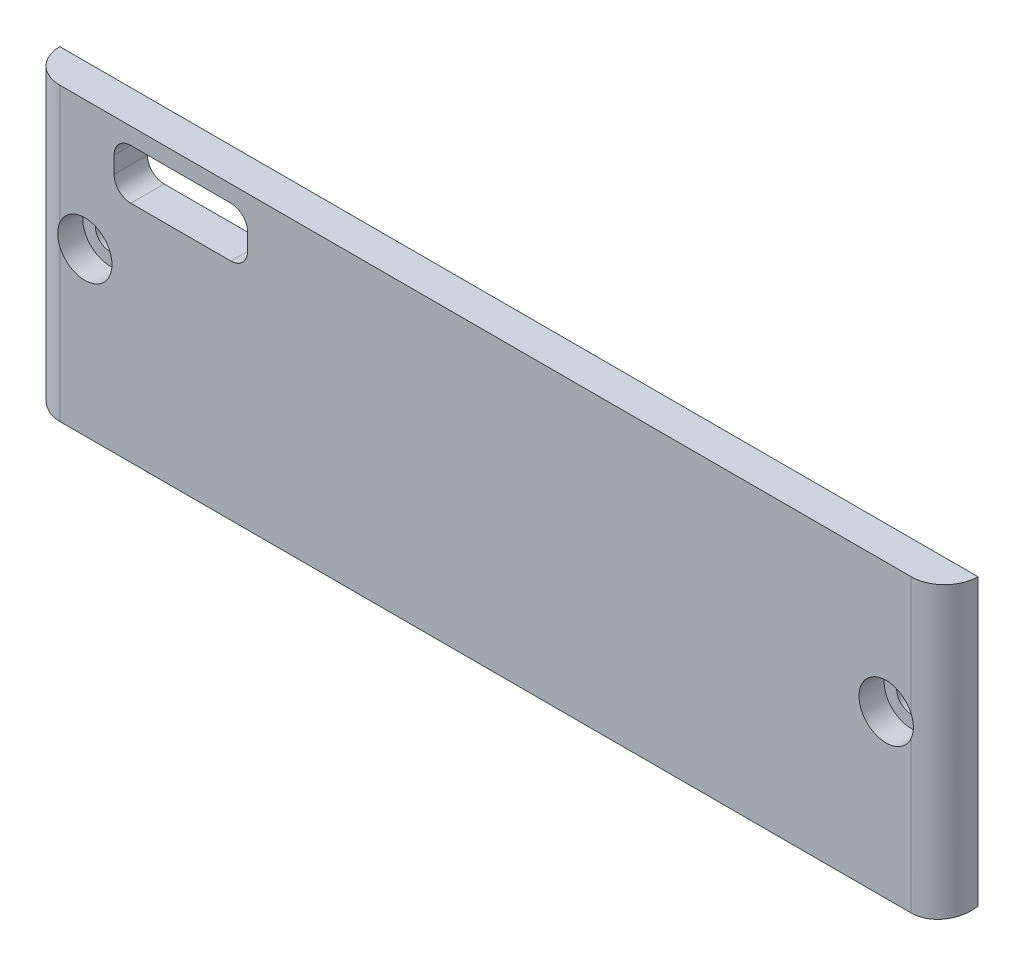
ISO-10303-21;
HEADER;
FILE_DESCRIPTION(('STEP AP214'),'2;1');
FILE_NAME('part.step','',(''),(''),'','','');
FILE_SCHEMA(('AUTOMOTIVE_DESIGN { 1 0 10303 214 1 1 1 1 }'));
ENDSEC;
DATA;
#1=APPLICATION_CONTEXT('core data for automotive mechanical design processes');
#2=APPLICATION_PROTOCOL_DEFINITION('international standard','automotive_design',2000,#1);
#3=PRODUCT_CONTEXT('',#1,'mechanical');
#4=PRODUCT('Part','Part','',(#3));
#5=PRODUCT_RELATED_PRODUCT_CATEGORY('part','',(#4));
#6=PRODUCT_DEFINITION_FORMATION('','',#4);
#7=PRODUCT_DEFINITION_CONTEXT('part definition',#1,'design');
#8=PRODUCT_DEFINITION('design','',#6,#7);
#9=PRODUCT_DEFINITION_SHAPE('','',#8);
#10=(LENGTH_UNIT() NAMED_UNIT(*) SI_UNIT(.MILLI.,.METRE.));
#11=(NAMED_UNIT(*) PLANE_ANGLE_UNIT() SI_UNIT($,.RADIAN.));
#12=(NAMED_UNIT(*) SI_UNIT($,.STERADIAN.) SOLID_ANGLE_UNIT());
#13=UNCERTAINTY_MEASURE_WITH_UNIT(LENGTH_MEASURE(1.E-05),#10,'distance_accuracy_value','');
#14=(GEOMETRIC_REPRESENTATION_CONTEXT(3) GLOBAL_UNCERTAINTY_ASSIGNED_CONTEXT((#13)) GLOBAL_UNIT_ASSIGNED_CONTEXT((#10,
#11,#12)) REPRESENTATION_CONTEXT('',''));
#15=CARTESIAN_POINT('',(0.,0.,0.));
#16=DIRECTION('',(0.,0.,1.));
#17=DIRECTION('',(1.,0.,0.));
#18=AXIS2_PLACEMENT_3D('',#15,#16,#17);
#19=CARTESIAN_POINT('',(103.,18.69,0.));
#20=DIRECTION('',(0.,0.,1.));
#21=DIRECTION('',(1.,0.,0.));
#22=AXIS2_PLACEMENT_3D('',#19,#20,#21);
#23=CYLINDRICAL_SURFACE('',#22,1.75);
#24=CARTESIAN_POINT('',(103.,18.69,0.));
#25=DIRECTION('',(0.,0.,1.));
#26=DIRECTION('',(1.,0.,0.));
#27=AXIS2_PLACEMENT_3D('',#24,#25,#26);
#28=CIRCLE('',#27,1.75);
#29=CARTESIAN_POINT('',(104.75,18.69,0.));
#30=VERTEX_POINT('',#29);
#31=EDGE_CURVE('E272',#30,#30,#28,.T.);
#32=ORIENTED_EDGE('',*,*,#31,.F.);
#33=EDGE_LOOP('',(#32));
#34=FACE_BOUND('',#33,.T.);
#35=CARTESIAN_POINT('',(103.,18.69,1.));
#36=DIRECTION('',(0.,0.,1.));
#37=DIRECTION('',(1.,0.,0.));
#38=AXIS2_PLACEMENT_3D('',#35,#36,#37);
#39=CIRCLE('',#38,1.75);
#40=CARTESIAN_POINT('',(104.75,18.69,1.));
#41=VERTEX_POINT('',#40);
#42=EDGE_CURVE('E275',#41,#41,#39,.F.);
#43=ORIENTED_EDGE('',*,*,#42,.F.);
#44=EDGE_LOOP('',(#43));
#45=FACE_BOUND('',#44,.T.);
#46=ADVANCED_FACE('F43',(#34,#45),#23,.F.);
#47=CARTESIAN_POINT('',(7.,18.69,0.));
#48=DIRECTION('',(0.,0.,1.));
#49=DIRECTION('',(1.,0.,0.));
#50=AXIS2_PLACEMENT_3D('',#47,#48,#49);
#51=CYLINDRICAL_SURFACE('',#50,1.75);
#52=CARTESIAN_POINT('',(7.,18.69,0.));
#53=DIRECTION('',(0.,0.,1.));
#54=DIRECTION('',(1.,0.,0.));
#55=AXIS2_PLACEMENT_3D('',#52,#53,#54);
#56=CIRCLE('',#55,1.75);
#57=CARTESIAN_POINT('',(8.75,18.69,0.));
#58=VERTEX_POINT('',#57);
#59=EDGE_CURVE('E267',#58,#58,#56,.T.);
#60=ORIENTED_EDGE('',*,*,#59,.F.);
#61=EDGE_LOOP('',(#60));
#62=FACE_BOUND('',#61,.T.);
#63=CARTESIAN_POINT('',(7.,18.69,1.));
#64=DIRECTION('',(0.,0.,1.));
#65=DIRECTION('',(1.,0.,0.));
#66=AXIS2_PLACEMENT_3D('',#63,#64,#65);
#67=CIRCLE('',#66,1.75);
#68=CARTESIAN_POINT('',(8.75,18.69,1.));
#69=VERTEX_POINT('',#68);
#70=EDGE_CURVE('E255',#69,#69,#67,.F.);
#71=ORIENTED_EDGE('',*,*,#70,.F.);
#72=EDGE_LOOP('',(#71));
#73=FACE_BOUND('',#72,.T.);
#74=ADVANCED_FACE('F345',(#62,#73),#51,.F.);
#75=CARTESIAN_POINT('',(0.,34.19,4.));
#76=DIRECTION('',(0.,-1.,0.));
#77=DIRECTION('',(0.,0.,-1.));
#78=AXIS2_PLACEMENT_3D('',#75,#76,#77);
#79=PLANE('',#78);
#80=DIRECTION('',(-1.,0.,0.));
#81=VECTOR('',#80,1.);
#82=CARTESIAN_POINT('',(0.,34.19,0.));
#83=LINE('',#82,#81);
#84=CARTESIAN_POINT('',(110.,34.19,0.));
#85=VERTEX_POINT('',#84);
#86=CARTESIAN_POINT('',(0.,34.19,0.));
#87=VERTEX_POINT('',#86);
#88=EDGE_CURVE('E283',#85,#87,#83,.T.);
#89=ORIENTED_EDGE('',*,*,#88,.T.);
#90=CARTESIAN_POINT('',(4.,34.19,0.));
#91=DIRECTION('',(0.,-1.,0.));
#92=DIRECTION('',(0.,0.,-1.));
#93=AXIS2_PLACEMENT_3D('',#90,#91,#92);
#94=CIRCLE('',#93,4.);
#95=CARTESIAN_POINT('',(4.,34.19,4.));
#96=VERTEX_POINT('',#95);
#97=EDGE_CURVE('E58',#87,#96,#94,.F.);
#98=ORIENTED_EDGE('',*,*,#97,.T.);
#99=DIRECTION('',(-1.,0.,0.));
#100=VECTOR('',#99,1.);
#101=CARTESIAN_POINT('',(0.,34.19,4.));
#102=LINE('',#101,#100);
#103=CARTESIAN_POINT('',(106.,34.19,4.));
#104=VERTEX_POINT('',#103);
#105=EDGE_CURVE('E280',#104,#96,#102,.T.);
#106=ORIENTED_EDGE('',*,*,#105,.F.);
#107=CARTESIAN_POINT('',(106.,34.19,0.));
#108=DIRECTION('',(0.,-1.,0.));
#109=DIRECTION('',(0.,0.,-1.));
#110=AXIS2_PLACEMENT_3D('',#107,#108,#109);
#111=CIRCLE('',#110,4.);
#112=EDGE_CURVE('E367',#104,#85,#111,.F.);
#113=ORIENTED_EDGE('',*,*,#112,.T.);
#114=EDGE_LOOP('',(#89,#98,#106,#113));
#115=FACE_BOUND('',#114,.T.);
#116=ADVANCED_FACE('F348',(#115),#79,.F.);
#117=CARTESIAN_POINT('',(0.,0.,4.));
#118=DIRECTION('',(0.,0.,-1.));
#119=DIRECTION('',(-1.,0.,0.));
#120=AXIS2_PLACEMENT_3D('',#117,#118,#119);
#121=PLANE('',#120);
#122=DIRECTION('',(0.,-1.,0.));
#123=VECTOR('',#122,1.);
#124=CARTESIAN_POINT('',(10.5,30.19,4.));
#125=LINE('',#124,#123);
#126=CARTESIAN_POINT('',(10.5,30.19,4.));
#127=VERTEX_POINT('',#126);
#128=CARTESIAN_POINT('',(10.5,28.19,4.));
#129=VERTEX_POINT('',#128);
#130=EDGE_CURVE('E208',#127,#129,#125,.T.);
#131=ORIENTED_EDGE('',*,*,#130,.F.);
#132=CARTESIAN_POINT('',(12.5,30.19,4.));
#133=DIRECTION('',(0.,0.,1.));
#134=DIRECTION('',(-1.,0.,0.));
#135=AXIS2_PLACEMENT_3D('',#132,#133,#134);
#136=CIRCLE('',#135,2.);
#137=CARTESIAN_POINT('',(12.5,32.19,4.));
#138=VERTEX_POINT('',#137);
#139=EDGE_CURVE('E157',#138,#127,#136,.T.);
#140=ORIENTED_EDGE('',*,*,#139,.F.);
#141=DIRECTION('',(-1.,0.,0.));
#142=VECTOR('',#141,1.);
#143=CARTESIAN_POINT('',(12.5,32.19,4.));
#144=LINE('',#143,#142);
#145=CARTESIAN_POINT('',(24.5,32.19,4.));
#146=VERTEX_POINT('',#145);
#147=EDGE_CURVE('E179',#146,#138,#144,.T.);
#148=ORIENTED_EDGE('',*,*,#147,.F.);
#149=CARTESIAN_POINT('',(24.5,30.19,4.));
#150=DIRECTION('',(0.,0.,1.));
#151=DIRECTION('',(-1.,0.,0.));
#152=AXIS2_PLACEMENT_3D('',#149,#150,#151);
#153=CIRCLE('',#152,2.00000000000001);
#154=CARTESIAN_POINT('',(26.5,30.19,4.));
#155=VERTEX_POINT('',#154);
#156=EDGE_CURVE('E185',#155,#146,#153,.T.);
#157=ORIENTED_EDGE('',*,*,#156,.F.);
#158=DIRECTION('',(0.,1.,0.));
#159=VECTOR('',#158,1.);
#160=CARTESIAN_POINT('',(26.5,30.19,4.));
#161=LINE('',#160,#159);
#162=CARTESIAN_POINT('',(26.5,28.19,4.));
#163=VERTEX_POINT('',#162);
#164=EDGE_CURVE('E223',#163,#155,#161,.T.);
#165=ORIENTED_EDGE('',*,*,#164,.F.);
#166=CARTESIAN_POINT('',(24.5,28.19,4.));
#167=DIRECTION('',(0.,0.,1.));
#168=DIRECTION('',(1.,0.,0.));
#169=AXIS2_PLACEMENT_3D('',#166,#167,#168);
#170=CIRCLE('',#169,2.);
#171=CARTESIAN_POINT('',(24.5,26.19,4.));
#172=VERTEX_POINT('',#171);
#173=EDGE_CURVE('E219',#172,#163,#170,.T.);
#174=ORIENTED_EDGE('',*,*,#173,.F.);
#175=DIRECTION('',(1.,0.,0.));
#176=VECTOR('',#175,1.);
#177=CARTESIAN_POINT('',(12.5,26.19,4.));
#178=LINE('',#177,#176);
#179=CARTESIAN_POINT('',(12.5,26.19,4.));
#180=VERTEX_POINT('',#179);
#181=EDGE_CURVE('E215',#180,#172,#178,.T.);
#182=ORIENTED_EDGE('',*,*,#181,.F.);
#183=CARTESIAN_POINT('',(12.5,28.19,4.));
#184=DIRECTION('',(0.,0.,1.));
#185=DIRECTION('',(-1.,0.,0.));
#186=AXIS2_PLACEMENT_3D('',#183,#184,#185);
#187=CIRCLE('',#186,2.);
#188=EDGE_CURVE('E211',#129,#180,#187,.T.);
#189=ORIENTED_EDGE('',*,*,#188,.F.);
#190=EDGE_LOOP('',(#131,#140,#148,#157,#165,#174,#182,#189));
#191=FACE_BOUND('',#190,.T.);
#192=ORIENTED_EDGE('',*,*,#105,.T.);
#193=DIRECTION('',(0.,-1.,0.));
#194=VECTOR('',#193,1.);
#195=CARTESIAN_POINT('',(4.,0.,4.));
#196=LINE('',#195,#194);
#197=CARTESIAN_POINT('',(4.,19.94,4.));
#198=VERTEX_POINT('',#197);
#199=EDGE_CURVE('E312',#96,#198,#196,.T.);
#200=ORIENTED_EDGE('',*,*,#199,.T.);
#201=CARTESIAN_POINT('',(7.,18.69,4.));
#202=DIRECTION('',(0.,0.,1.));
#203=DIRECTION('',(1.,0.,0.));
#204=AXIS2_PLACEMENT_3D('',#201,#202,#203);
#205=CIRCLE('',#204,3.25);
#206=CARTESIAN_POINT('',(4.,17.44,4.));
#207=VERTEX_POINT('',#206);
#208=EDGE_CURVE('E256',#207,#198,#205,.T.);
#209=ORIENTED_EDGE('',*,*,#208,.F.);
#210=DIRECTION('',(0.,-1.,0.));
#211=VECTOR('',#210,1.);
#212=CARTESIAN_POINT('',(4.,0.,4.));
#213=LINE('',#212,#211);
#214=CARTESIAN_POINT('',(4.,-0.705307922833832,4.));
#215=VERTEX_POINT('',#214);
#216=EDGE_CURVE('E309',#207,#215,#213,.T.);
#217=ORIENTED_EDGE('',*,*,#216,.T.);
#218=DIRECTION('',(1.,0.,0.));
#219=VECTOR('',#218,1.);
#220=CARTESIAN_POINT('',(0.,-0.705307922833832,4.));
#221=LINE('',#220,#219);
#222=CARTESIAN_POINT('',(106.,-0.705307922833832,4.));
#223=VERTEX_POINT('',#222);
#224=EDGE_CURVE('E271',#215,#223,#221,.T.);
#225=ORIENTED_EDGE('',*,*,#224,.T.);
#226=DIRECTION('',(0.,1.,0.));
#227=VECTOR('',#226,1.);
#228=CARTESIAN_POINT('',(106.,0.,4.));
#229=LINE('',#228,#227);
#230=CARTESIAN_POINT('',(106.,17.44,4.));
#231=VERTEX_POINT('',#230);
#232=EDGE_CURVE('E305',#223,#231,#229,.T.);
#233=ORIENTED_EDGE('',*,*,#232,.T.);
#234=CARTESIAN_POINT('',(103.,18.69,4.));
#235=DIRECTION('',(0.,0.,1.));
#236=DIRECTION('',(1.,0.,0.));
#237=AXIS2_PLACEMENT_3D('',#234,#235,#236);
#238=CIRCLE('',#237,3.25000000000001);
#239=CARTESIAN_POINT('',(106.,19.94,4.));
#240=VERTEX_POINT('',#239);
#241=EDGE_CURVE('E260',#240,#231,#238,.T.);
#242=ORIENTED_EDGE('',*,*,#241,.F.);
#243=DIRECTION('',(0.,1.,0.));
#244=VECTOR('',#243,1.);
#245=CARTESIAN_POINT('',(106.,0.,4.));
#246=LINE('',#245,#244);
#247=EDGE_CURVE('E71',#240,#104,#246,.T.);
#248=ORIENTED_EDGE('',*,*,#247,.T.);
#249=EDGE_LOOP('',(#192,#200,#209,#217,#225,#233,#242,#248));
#250=FACE_BOUND('',#249,.T.);
#251=ADVANCED_FACE('F357',(#191,#250),#121,.F.);
#252=CARTESIAN_POINT('',(0.,0.,0.));
#253=DIRECTION('',(0.,0.,-1.));
#254=DIRECTION('',(-1.,0.,0.));
#255=AXIS2_PLACEMENT_3D('',#252,#253,#254);
#256=PLANE('',#255);
#257=CARTESIAN_POINT('',(12.5,30.19,0.));
#258=DIRECTION('',(0.,0.,1.));
#259=DIRECTION('',(-1.,0.,0.));
#260=AXIS2_PLACEMENT_3D('',#257,#258,#259);
#261=CIRCLE('',#260,2.);
#262=CARTESIAN_POINT('',(12.5,32.19,0.));
#263=VERTEX_POINT('',#262);
#264=CARTESIAN_POINT('',(10.5,30.19,0.));
#265=VERTEX_POINT('',#264);
#266=EDGE_CURVE('E154',#263,#265,#261,.T.);
#267=ORIENTED_EDGE('',*,*,#266,.T.);
#268=DIRECTION('',(0.,-1.,0.));
#269=VECTOR('',#268,1.);
#270=CARTESIAN_POINT('',(10.5,30.19,0.));
#271=LINE('',#270,#269);
#272=CARTESIAN_POINT('',(10.5,28.19,0.));
#273=VERTEX_POINT('',#272);
#274=EDGE_CURVE('E167',#265,#273,#271,.T.);
#275=ORIENTED_EDGE('',*,*,#274,.T.);
#276=CARTESIAN_POINT('',(12.5,28.19,0.));
#277=DIRECTION('',(0.,0.,1.));
#278=DIRECTION('',(-1.,0.,0.));
#279=AXIS2_PLACEMENT_3D('',#276,#277,#278);
#280=CIRCLE('',#279,2.);
#281=CARTESIAN_POINT('',(12.5,26.19,0.));
#282=VERTEX_POINT('',#281);
#283=EDGE_CURVE('E172',#273,#282,#280,.T.);
#284=ORIENTED_EDGE('',*,*,#283,.T.);
#285=DIRECTION('',(1.,0.,0.));
#286=VECTOR('',#285,1.);
#287=CARTESIAN_POINT('',(12.5,26.19,0.));
#288=LINE('',#287,#286);
#289=CARTESIAN_POINT('',(24.5,26.19,0.));
#290=VERTEX_POINT('',#289);
#291=EDGE_CURVE('E190',#282,#290,#288,.T.);
#292=ORIENTED_EDGE('',*,*,#291,.T.);
#293=CARTESIAN_POINT('',(24.5,28.19,0.));
#294=DIRECTION('',(0.,0.,1.));
#295=DIRECTION('',(1.,0.,0.));
#296=AXIS2_PLACEMENT_3D('',#293,#294,#295);
#297=CIRCLE('',#296,2.);
#298=CARTESIAN_POINT('',(26.5,28.19,0.));
#299=VERTEX_POINT('',#298);
#300=EDGE_CURVE('E194',#290,#299,#297,.T.);
#301=ORIENTED_EDGE('',*,*,#300,.T.);
#302=DIRECTION('',(0.,1.,0.));
#303=VECTOR('',#302,1.);
#304=CARTESIAN_POINT('',(26.5,30.19,0.));
#305=LINE('',#304,#303);
#306=CARTESIAN_POINT('',(26.5,30.19,0.));
#307=VERTEX_POINT('',#306);
#308=EDGE_CURVE('E198',#299,#307,#305,.T.);
#309=ORIENTED_EDGE('',*,*,#308,.T.);
#310=CARTESIAN_POINT('',(24.5,30.19,0.));
#311=DIRECTION('',(0.,0.,1.));
#312=DIRECTION('',(-1.,0.,0.));
#313=AXIS2_PLACEMENT_3D('',#310,#311,#312);
#314=CIRCLE('',#313,2.00000000000001);
#315=CARTESIAN_POINT('',(24.5,32.19,0.));
#316=VERTEX_POINT('',#315);
#317=EDGE_CURVE('E202',#307,#316,#314,.T.);
#318=ORIENTED_EDGE('',*,*,#317,.T.);
#319=DIRECTION('',(-1.,0.,0.));
#320=VECTOR('',#319,1.);
#321=CARTESIAN_POINT('',(12.5,32.19,0.));
#322=LINE('',#321,#320);
#323=EDGE_CURVE('E163',#316,#263,#322,.T.);
#324=ORIENTED_EDGE('',*,*,#323,.T.);
#325=EDGE_LOOP('',(#267,#275,#284,#292,#301,#309,#318,#324));
#326=FACE_BOUND('',#325,.T.);
#327=ORIENTED_EDGE('',*,*,#59,.T.);
#328=EDGE_LOOP('',(#327));
#329=FACE_BOUND('',#328,.T.);
#330=ORIENTED_EDGE('',*,*,#31,.T.);
#331=EDGE_LOOP('',(#330));
#332=FACE_BOUND('',#331,.T.);
#333=DIRECTION('',(0.,-1.,0.));
#334=VECTOR('',#333,1.);
#335=CARTESIAN_POINT('',(0.,0.,0.));
#336=LINE('',#335,#334);
#337=CARTESIAN_POINT('',(0.,0.,0.));
#338=VERTEX_POINT('',#337);
#339=EDGE_CURVE('E279',#87,#338,#336,.T.);
#340=ORIENTED_EDGE('',*,*,#339,.F.);
#341=ORIENTED_EDGE('',*,*,#88,.F.);
#342=DIRECTION('',(0.,1.,0.));
#343=VECTOR('',#342,1.);
#344=CARTESIAN_POINT('',(110.,0.,0.));
#345=LINE('',#344,#343);
#346=CARTESIAN_POINT('',(110.,0.,0.));
#347=VERTEX_POINT('',#346);
#348=EDGE_CURVE('E291',#347,#85,#345,.T.);
#349=ORIENTED_EDGE('',*,*,#348,.F.);
#350=DIRECTION('',(1.,0.,0.));
#351=VECTOR('',#350,1.);
#352=CARTESIAN_POINT('',(0.,0.,0.));
#353=LINE('',#352,#351);
#354=EDGE_CURVE('E287',#338,#347,#353,.T.);
#355=ORIENTED_EDGE('',*,*,#354,.F.);
#356=EDGE_LOOP('',(#340,#341,#349,#355));
#357=FACE_BOUND('',#356,.T.);
#358=ADVANCED_FACE('F174',(#326,#329,#332,#357),#256,.T.);
#359=CARTESIAN_POINT('',(0.,-0.705307922833832,4.));
#360=DIRECTION('',(0.,-0.984807753012209,-0.173648177666924));
#361=DIRECTION('',(0.,0.173648177666924,-0.984807753012209));
#362=AXIS2_PLACEMENT_3D('',#359,#360,#361);
#363=PLANE('',#362);
#364=ORIENTED_EDGE('',*,*,#224,.F.);
#365=CARTESIAN_POINT('',(4.,0.,0.));
#366=DIRECTION('',(0.,-0.984807753012209,-0.173648177666924));
#367=DIRECTION('',(0.,-0.173648177666924,0.984807753012209));
#368=AXIS2_PLACEMENT_3D('',#365,#366,#367);
#369=ELLIPSE('',#368,4.06170644754298,4.);
#370=EDGE_CURVE('E375',#215,#338,#369,.T.);
#371=ORIENTED_EDGE('',*,*,#370,.T.);
#372=ORIENTED_EDGE('',*,*,#354,.T.);
#373=CARTESIAN_POINT('',(106.,0.,0.));
#374=DIRECTION('',(0.,-0.984807753012209,-0.173648177666924));
#375=DIRECTION('',(0.,0.173648177666924,-0.984807753012209));
#376=AXIS2_PLACEMENT_3D('',#373,#374,#375);
#377=ELLIPSE('',#376,4.06170644754298,4.);
#378=EDGE_CURVE('E324',#347,#223,#377,.T.);
#379=ORIENTED_EDGE('',*,*,#378,.T.);
#380=EDGE_LOOP('',(#364,#371,#372,#379));
#381=FACE_BOUND('',#380,.T.);
#382=ADVANCED_FACE('F353',(#381),#363,.T.);
#383=CARTESIAN_POINT('',(7.,18.69,1.));
#384=DIRECTION('',(0.,0.,1.));
#385=DIRECTION('',(1.,0.,0.));
#386=AXIS2_PLACEMENT_3D('',#383,#384,#385);
#387=PLANE('',#386);
#388=CARTESIAN_POINT('',(7.,18.69,1.));
#389=DIRECTION('',(0.,0.,1.));
#390=DIRECTION('',(1.,0.,0.));
#391=AXIS2_PLACEMENT_3D('',#388,#389,#390);
#392=CIRCLE('',#391,3.25);
#393=CARTESIAN_POINT('',(10.25,18.69,1.));
#394=VERTEX_POINT('',#393);
#395=EDGE_CURVE('E251',#394,#394,#392,.T.);
#396=ORIENTED_EDGE('',*,*,#395,.T.);
#397=EDGE_LOOP('',(#396));
#398=FACE_BOUND('',#397,.T.);
#399=ORIENTED_EDGE('',*,*,#70,.T.);
#400=EDGE_LOOP('',(#399));
#401=FACE_BOUND('',#400,.T.);
#402=ADVANCED_FACE('F334',(#398,#401),#387,.T.);
#403=CARTESIAN_POINT('',(7.,18.69,1.));
#404=DIRECTION('',(0.,0.,1.));
#405=DIRECTION('',(1.,0.,0.));
#406=AXIS2_PLACEMENT_3D('',#403,#404,#405);
#407=CYLINDRICAL_SURFACE('',#406,3.25);
#408=ORIENTED_EDGE('',*,*,#395,.F.);
#409=EDGE_LOOP('',(#408));
#410=FACE_BOUND('',#409,.T.);
#411=ORIENTED_EDGE('',*,*,#208,.T.);
#412=CARTESIAN_POINT('',(4.,19.94,4.));
#413=CARTESIAN_POINT('',(3.96487210402012,19.8557180794909,3.9999812261752));
#414=CARTESIAN_POINT('',(3.93331521126321,19.7699526719788,3.99953635731707));
#415=CARTESIAN_POINT('',(3.8775254882812,19.5960753121869,3.99822700364716));
#416=CARTESIAN_POINT('',(3.853292592872,19.5079633807989,3.99736252257015));
#417=CARTESIAN_POINT('',(3.8123203059449,19.3299598203715,3.99564600081904));
#418=CARTESIAN_POINT('',(3.7955853071785,19.2400671801939,3.9947939677198));
#419=CARTESIAN_POINT('',(3.76974621185374,19.0591942299652,3.99338876149979));
#420=CARTESIAN_POINT('',(3.76064169845937,18.9682139796032,3.99283557205448));
#421=CARTESIAN_POINT('',(3.75012412875219,18.7857376967984,3.99219103549793));
#422=CARTESIAN_POINT('',(3.74871702094921,18.6942413201376,3.99210004557565));
#423=CARTESIAN_POINT('',(3.75362042257702,18.5114563499815,3.99240569884154));
#424=CARTESIAN_POINT('',(3.75993090021948,18.4201677556319,3.99280234002118));
#425=CARTESIAN_POINT('',(3.78020524198077,18.2386117777803,3.99396955067832));
#426=CARTESIAN_POINT('',(3.79415562906963,18.1483428808608,3.99473946142351));
#427=CARTESIAN_POINT('',(3.82959591693698,17.9693355846494,3.99640795948413));
#428=CARTESIAN_POINT('',(3.85108224975844,17.880596481887,3.9973064857865));
#429=CARTESIAN_POINT('',(3.89348429747581,17.7329436887971,3.99861858709238));
#430=CARTESIAN_POINT('',(3.91243812058702,17.6734595770325,3.99909570465321));
#431=CARTESIAN_POINT('',(3.95371077010315,17.5557567120501,3.99978446069836));
#432=CARTESIAN_POINT('',(3.97602514624972,17.4975364001819,3.99999644688257));
#433=CARTESIAN_POINT('',(4.,17.44,4.));
#434=B_SPLINE_CURVE_WITH_KNOTS('',3,(#412,#413,#414,#415,#416,#417,#418,#419,#420,#421,#422,
#423,#424,#425,#426,#427,#428,#429,#430,#431,#432,#433),.UNSPECIFIED.,.F.,.F.,(4,2,2,2,2,2,2,2,
2,2,4),(0.,0.27384044895103,0.547678460630937,0.82167669516559,1.09565996082617,
1.36985492926554,1.6440487683136,1.91776047193921,2.19134275900061,2.37854315136214,
2.56549778616185),.UNSPECIFIED.);
#435=EDGE_CURVE('E316',#198,#207,#434,.T.);
#436=ORIENTED_EDGE('',*,*,#435,.T.);
#437=EDGE_LOOP('',(#411,#436));
#438=FACE_BOUND('',#437,.T.);
#439=ADVANCED_FACE('F329',(#410,#438),#407,.F.);
#440=CARTESIAN_POINT('',(103.,18.69,1.));
#441=DIRECTION('',(0.,0.,1.));
#442=DIRECTION('',(1.,0.,0.));
#443=AXIS2_PLACEMENT_3D('',#440,#441,#442);
#444=PLANE('',#443);
#445=CARTESIAN_POINT('',(103.,18.69,1.));
#446=DIRECTION('',(0.,0.,1.));
#447=DIRECTION('',(1.,0.,0.));
#448=AXIS2_PLACEMENT_3D('',#445,#446,#447);
#449=CIRCLE('',#448,3.25000000000001);
#450=CARTESIAN_POINT('',(106.25,18.69,1.));
#451=VERTEX_POINT('',#450);
#452=EDGE_CURVE('E233',#451,#451,#449,.T.);
#453=ORIENTED_EDGE('',*,*,#452,.T.);
#454=EDGE_LOOP('',(#453));
#455=FACE_BOUND('',#454,.T.);
#456=ORIENTED_EDGE('',*,*,#42,.T.);
#457=EDGE_LOOP('',(#456));
#458=FACE_BOUND('',#457,.T.);
#459=ADVANCED_FACE('F333',(#455,#458),#444,.T.);
#460=CARTESIAN_POINT('',(103.,18.69,1.));
#461=DIRECTION('',(0.,0.,1.));
#462=DIRECTION('',(1.,0.,0.));
#463=AXIS2_PLACEMENT_3D('',#460,#461,#462);
#464=CYLINDRICAL_SURFACE('',#463,3.25000000000001);
#465=ORIENTED_EDGE('',*,*,#452,.F.);
#466=EDGE_LOOP('',(#465));
#467=FACE_BOUND('',#466,.T.);
#468=ORIENTED_EDGE('',*,*,#241,.T.);
#469=CARTESIAN_POINT('',(106.,17.44,4.));
#470=CARTESIAN_POINT('',(106.03512789598,17.524281920509,3.9999812261752));
#471=CARTESIAN_POINT('',(106.066684788737,17.6100473280212,3.99953635731707));
#472=CARTESIAN_POINT('',(106.122474511719,17.7839246878131,3.99822700364716));
#473=CARTESIAN_POINT('',(106.146707407128,17.872036619201,3.99736252257015));
#474=CARTESIAN_POINT('',(106.187679694055,18.0500401796285,3.99564600081904));
#475=CARTESIAN_POINT('',(106.204414692822,18.139932819806,3.9947939677198));
#476=CARTESIAN_POINT('',(106.230253788146,18.3208057700348,3.99338876149979));
#477=CARTESIAN_POINT('',(106.239358301541,18.4117860203968,3.99283557205448));
#478=CARTESIAN_POINT('',(106.249875871248,18.5942623032016,3.99219103549793));
#479=CARTESIAN_POINT('',(106.251282979051,18.6857586798624,3.99210004557565));
#480=CARTESIAN_POINT('',(106.246379577423,18.8685436500185,3.99240569884154));
#481=CARTESIAN_POINT('',(106.240069099781,18.9598322443681,3.99280234002118));
#482=CARTESIAN_POINT('',(106.219794758019,19.1413882222197,3.99396955067832));
#483=CARTESIAN_POINT('',(106.20584437093,19.2316571191392,3.99473946142351));
#484=CARTESIAN_POINT('',(106.170404083063,19.4106644153506,3.99640795948413));
#485=CARTESIAN_POINT('',(106.148917750242,19.499403518113,3.9973064857865));
#486=CARTESIAN_POINT('',(106.106515702524,19.6470563112029,3.99861858709238));
#487=CARTESIAN_POINT('',(106.087561879413,19.7065404229675,3.99909570465321));
#488=CARTESIAN_POINT('',(106.046289229897,19.8242432879499,3.99978446069835));
#489=CARTESIAN_POINT('',(106.02397485375,19.8824635998181,3.99999644688257));
#490=CARTESIAN_POINT('',(106.,19.94,4.));
#491=B_SPLINE_CURVE_WITH_KNOTS('',3,(#469,#470,#471,#472,#473,#474,#475,#476,#477,#478,#479,
#480,#481,#482,#483,#484,#485,#486,#487,#488,#489,#490),.UNSPECIFIED.,.F.,.F.,(4,2,2,2,2,2,2,2,
2,2,4),(0.,0.273840448951035,0.547678460630943,0.821676695165595,1.09565996082618,
1.36985492926555,1.64404876831361,1.91776047193922,2.19134275900062,2.37854315136216,
2.56549778616189),.UNSPECIFIED.);
#492=EDGE_CURVE('E11',#231,#240,#491,.T.);
#493=ORIENTED_EDGE('',*,*,#492,.T.);
#494=EDGE_LOOP('',(#468,#493));
#495=FACE_BOUND('',#494,.T.);
#496=ADVANCED_FACE('F337',(#467,#495),#464,.F.);
#497=CARTESIAN_POINT('',(12.5,30.19,0.));
#498=DIRECTION('',(0.,0.,1.));
#499=DIRECTION('',(1.,0.,0.));
#500=AXIS2_PLACEMENT_3D('',#497,#498,#499);
#501=CYLINDRICAL_SURFACE('',#500,2.);
#502=ORIENTED_EDGE('',*,*,#139,.T.);
#503=DIRECTION('',(0.,0.,1.));
#504=VECTOR('',#503,1.);
#505=CARTESIAN_POINT('',(10.5,30.19,0.));
#506=LINE('',#505,#504);
#507=EDGE_CURVE('E150',#265,#127,#506,.T.);
#508=ORIENTED_EDGE('',*,*,#507,.F.);
#509=ORIENTED_EDGE('',*,*,#266,.F.);
#510=DIRECTION('',(0.,0.,1.));
#511=VECTOR('',#510,1.);
#512=CARTESIAN_POINT('',(12.5,32.19,0.));
#513=LINE('',#512,#511);
#514=EDGE_CURVE('E230',#263,#138,#513,.T.);
#515=ORIENTED_EDGE('',*,*,#514,.T.);
#516=EDGE_LOOP('',(#502,#508,#509,#515));
#517=FACE_BOUND('',#516,.T.);
#518=ADVANCED_FACE('F152',(#517),#501,.F.);
#519=CARTESIAN_POINT('',(12.5,32.19,0.));
#520=DIRECTION('',(0.,1.,0.));
#521=DIRECTION('',(-1.,0.,0.));
#522=AXIS2_PLACEMENT_3D('',#519,#520,#521);
#523=PLANE('',#522);
#524=ORIENTED_EDGE('',*,*,#147,.T.);
#525=ORIENTED_EDGE('',*,*,#514,.F.);
#526=ORIENTED_EDGE('',*,*,#323,.F.);
#527=DIRECTION('',(0.,0.,1.));
#528=VECTOR('',#527,1.);
#529=CARTESIAN_POINT('',(24.5,32.19,0.));
#530=LINE('',#529,#528);
#531=EDGE_CURVE('E234',#316,#146,#530,.T.);
#532=ORIENTED_EDGE('',*,*,#531,.T.);
#533=EDGE_LOOP('',(#524,#525,#526,#532));
#534=FACE_BOUND('',#533,.T.);
#535=ADVANCED_FACE('F400',(#534),#523,.F.);
#536=CARTESIAN_POINT('',(24.5,30.19,0.));
#537=DIRECTION('',(0.,0.,1.));
#538=DIRECTION('',(1.,0.,0.));
#539=AXIS2_PLACEMENT_3D('',#536,#537,#538);
#540=CYLINDRICAL_SURFACE('',#539,2.00000000000001);
#541=ORIENTED_EDGE('',*,*,#156,.T.);
#542=ORIENTED_EDGE('',*,*,#531,.F.);
#543=ORIENTED_EDGE('',*,*,#317,.F.);
#544=DIRECTION('',(0.,0.,1.));
#545=VECTOR('',#544,1.);
#546=CARTESIAN_POINT('',(26.5,30.19,0.));
#547=LINE('',#546,#545);
#548=EDGE_CURVE('E237',#307,#155,#547,.T.);
#549=ORIENTED_EDGE('',*,*,#548,.T.);
#550=EDGE_LOOP('',(#541,#542,#543,#549));
#551=FACE_BOUND('',#550,.T.);
#552=ADVANCED_FACE('F403',(#551),#540,.F.);
#553=CARTESIAN_POINT('',(26.5,30.19,0.));
#554=DIRECTION('',(1.,0.,0.));
#555=DIRECTION('',(0.,1.,0.));
#556=AXIS2_PLACEMENT_3D('',#553,#554,#555);
#557=PLANE('',#556);
#558=ORIENTED_EDGE('',*,*,#164,.T.);
#559=ORIENTED_EDGE('',*,*,#548,.F.);
#560=ORIENTED_EDGE('',*,*,#308,.F.);
#561=DIRECTION('',(0.,0.,1.));
#562=VECTOR('',#561,1.);
#563=CARTESIAN_POINT('',(26.5,28.19,0.));
#564=LINE('',#563,#562);
#565=EDGE_CURVE('E240',#299,#163,#564,.T.);
#566=ORIENTED_EDGE('',*,*,#565,.T.);
#567=EDGE_LOOP('',(#558,#559,#560,#566));
#568=FACE_BOUND('',#567,.T.);
#569=ADVANCED_FACE('F408',(#568),#557,.F.);
#570=CARTESIAN_POINT('',(24.5,28.19,0.));
#571=DIRECTION('',(0.,0.,1.));
#572=DIRECTION('',(1.,0.,0.));
#573=AXIS2_PLACEMENT_3D('',#570,#571,#572);
#574=CYLINDRICAL_SURFACE('',#573,2.);
#575=ORIENTED_EDGE('',*,*,#173,.T.);
#576=ORIENTED_EDGE('',*,*,#565,.F.);
#577=ORIENTED_EDGE('',*,*,#300,.F.);
#578=DIRECTION('',(0.,0.,1.));
#579=VECTOR('',#578,1.);
#580=CARTESIAN_POINT('',(24.5,26.19,0.));
#581=LINE('',#580,#579);
#582=EDGE_CURVE('E243',#290,#172,#581,.T.);
#583=ORIENTED_EDGE('',*,*,#582,.T.);
#584=EDGE_LOOP('',(#575,#576,#577,#583));
#585=FACE_BOUND('',#584,.T.);
#586=ADVANCED_FACE('F414',(#585),#574,.F.);
#587=CARTESIAN_POINT('',(12.5,26.19,0.));
#588=DIRECTION('',(0.,-1.,0.));
#589=DIRECTION('',(0.,0.,-1.));
#590=AXIS2_PLACEMENT_3D('',#587,#588,#589);
#591=PLANE('',#590);
#592=ORIENTED_EDGE('',*,*,#181,.T.);
#593=ORIENTED_EDGE('',*,*,#582,.F.);
#594=ORIENTED_EDGE('',*,*,#291,.F.);
#595=DIRECTION('',(0.,0.,1.));
#596=VECTOR('',#595,1.);
#597=CARTESIAN_POINT('',(12.5,26.19,0.));
#598=LINE('',#597,#596);
#599=EDGE_CURVE('E246',#282,#180,#598,.T.);
#600=ORIENTED_EDGE('',*,*,#599,.T.);
#601=EDGE_LOOP('',(#592,#593,#594,#600));
#602=FACE_BOUND('',#601,.T.);
#603=ADVANCED_FACE('F395',(#602),#591,.F.);
#604=CARTESIAN_POINT('',(12.5,28.19,0.));
#605=DIRECTION('',(0.,0.,1.));
#606=DIRECTION('',(1.,0.,0.));
#607=AXIS2_PLACEMENT_3D('',#604,#605,#606);
#608=CYLINDRICAL_SURFACE('',#607,2.);
#609=ORIENTED_EDGE('',*,*,#188,.T.);
#610=ORIENTED_EDGE('',*,*,#599,.F.);
#611=ORIENTED_EDGE('',*,*,#283,.F.);
#612=DIRECTION('',(0.,0.,1.));
#613=VECTOR('',#612,1.);
#614=CARTESIAN_POINT('',(10.5,28.19,0.));
#615=LINE('',#614,#613);
#616=EDGE_CURVE('E162',#273,#129,#615,.T.);
#617=ORIENTED_EDGE('',*,*,#616,.T.);
#618=EDGE_LOOP('',(#609,#610,#611,#617));
#619=FACE_BOUND('',#618,.T.);
#620=ADVANCED_FACE('F391',(#619),#608,.F.);
#621=CARTESIAN_POINT('',(10.5,30.19,0.));
#622=DIRECTION('',(-1.,0.,0.));
#623=DIRECTION('',(0.,0.,1.));
#624=AXIS2_PLACEMENT_3D('',#621,#622,#623);
#625=PLANE('',#624);
#626=ORIENTED_EDGE('',*,*,#130,.T.);
#627=ORIENTED_EDGE('',*,*,#616,.F.);
#628=ORIENTED_EDGE('',*,*,#274,.F.);
#629=ORIENTED_EDGE('',*,*,#507,.T.);
#630=EDGE_LOOP('',(#626,#627,#628,#629));
#631=FACE_BOUND('',#630,.T.);
#632=ADVANCED_FACE('F168',(#631),#625,.F.);
#633=CARTESIAN_POINT('',(4.,0.,0.));
#634=DIRECTION('',(0.,-1.,0.));
#635=DIRECTION('',(0.,0.,-1.));
#636=AXIS2_PLACEMENT_3D('',#633,#634,#635);
#637=CYLINDRICAL_SURFACE('',#636,4.);
#638=ORIENTED_EDGE('',*,*,#97,.F.);
#639=ORIENTED_EDGE('',*,*,#339,.T.);
#640=ORIENTED_EDGE('',*,*,#370,.F.);
#641=ORIENTED_EDGE('',*,*,#216,.F.);
#642=ORIENTED_EDGE('',*,*,#435,.F.);
#643=ORIENTED_EDGE('',*,*,#199,.F.);
#644=EDGE_LOOP('',(#638,#639,#640,#641,#642,#643));
#645=FACE_BOUND('',#644,.T.);
#646=ADVANCED_FACE('F326',(#645),#637,.T.);
#647=CARTESIAN_POINT('',(106.,0.,0.));
#648=DIRECTION('',(0.,1.,0.));
#649=DIRECTION('',(0.,0.,1.));
#650=AXIS2_PLACEMENT_3D('',#647,#648,#649);
#651=CYLINDRICAL_SURFACE('',#650,4.);
#652=ORIENTED_EDGE('',*,*,#378,.F.);
#653=ORIENTED_EDGE('',*,*,#348,.T.);
#654=ORIENTED_EDGE('',*,*,#112,.F.);
#655=ORIENTED_EDGE('',*,*,#247,.F.);
#656=ORIENTED_EDGE('',*,*,#492,.F.);
#657=ORIENTED_EDGE('',*,*,#232,.F.);
#658=EDGE_LOOP('',(#652,#653,#654,#655,#656,#657));
#659=FACE_BOUND('',#658,.T.);
#660=ADVANCED_FACE('F45',(#659),#651,.T.);
#661=CLOSED_SHELL('',(#46,#74,#116,#251,#358,#382,#402,#439,#459,#496,#518,#535,#552,#569,#586,
#603,#620,#632,#646,#660));
#662=MANIFOLD_SOLID_BREP('B2',#661);
#663=ADVANCED_BREP_SHAPE_REPRESENTATION('',(#18,#662),#14);
#664=SHAPE_DEFINITION_REPRESENTATION(#9,#663);
ENDSEC;
END-ISO-10303-21;
